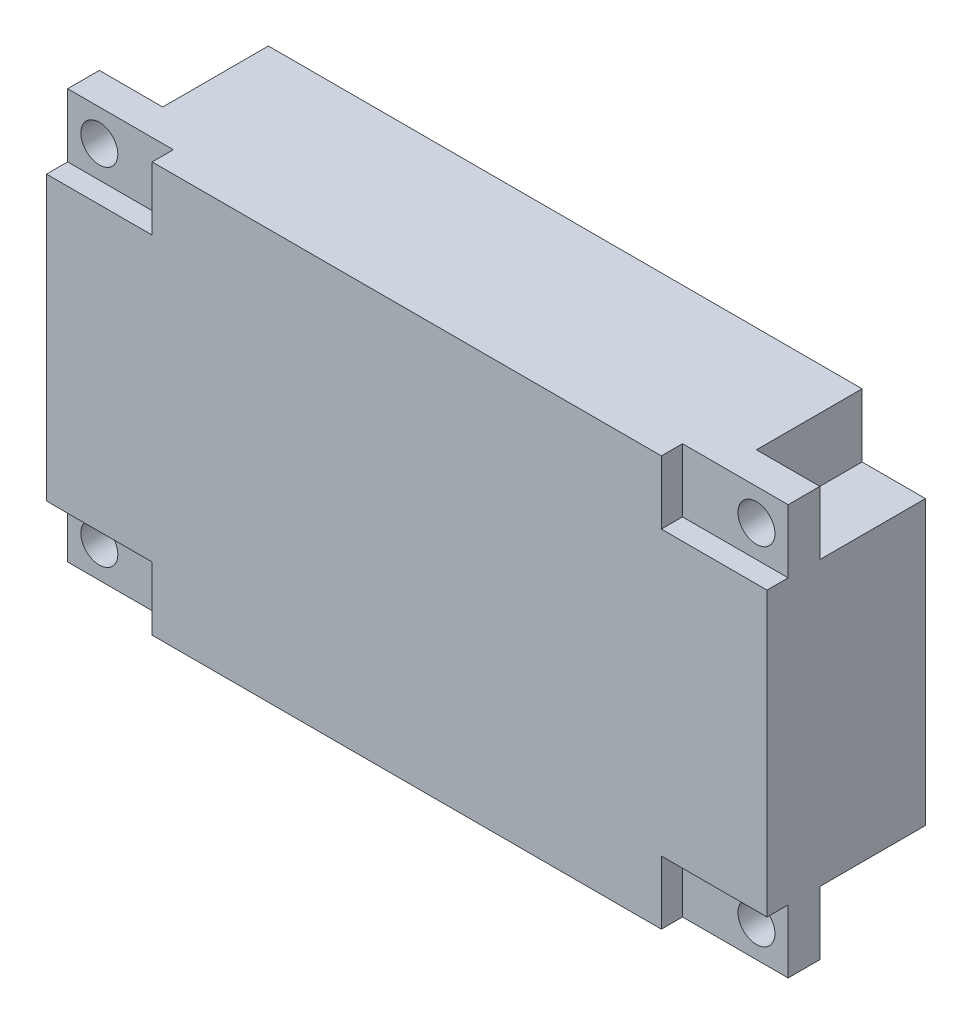
ISO-10303-21;
HEADER;
FILE_DESCRIPTION(('STEP AP214'),'2;1');
FILE_NAME('part.step','',(''),(''),'','','');
FILE_SCHEMA(('AUTOMOTIVE_DESIGN { 1 0 10303 214 1 1 1 1 }'));
ENDSEC;
DATA;
#1=APPLICATION_CONTEXT('core data for automotive mechanical design processes');
#2=APPLICATION_PROTOCOL_DEFINITION('international standard','automotive_design',2000,#1);
#3=PRODUCT_CONTEXT('',#1,'mechanical');
#4=PRODUCT('Part','Part','',(#3));
#5=PRODUCT_RELATED_PRODUCT_CATEGORY('part','',(#4));
#6=PRODUCT_DEFINITION_FORMATION('','',#4);
#7=PRODUCT_DEFINITION_CONTEXT('part definition',#1,'design');
#8=PRODUCT_DEFINITION('design','',#6,#7);
#9=PRODUCT_DEFINITION_SHAPE('','',#8);
#10=(LENGTH_UNIT() NAMED_UNIT(*) SI_UNIT(.MILLI.,.METRE.));
#11=(NAMED_UNIT(*) PLANE_ANGLE_UNIT() SI_UNIT($,.RADIAN.));
#12=(NAMED_UNIT(*) SI_UNIT($,.STERADIAN.) SOLID_ANGLE_UNIT());
#13=UNCERTAINTY_MEASURE_WITH_UNIT(LENGTH_MEASURE(1.E-05),#10,'distance_accuracy_value','');
#14=(GEOMETRIC_REPRESENTATION_CONTEXT(3) GLOBAL_UNCERTAINTY_ASSIGNED_CONTEXT((#13)) GLOBAL_UNIT_ASSIGNED_CONTEXT((#10,
#11,#12)) REPRESENTATION_CONTEXT('',''));
#15=CARTESIAN_POINT('',(0.,0.,0.));
#16=DIRECTION('',(0.,0.,1.));
#17=DIRECTION('',(1.,0.,0.));
#18=AXIS2_PLACEMENT_3D('',#15,#16,#17);
#19=CARTESIAN_POINT('',(65.2,3.,0.));
#20=DIRECTION('',(0.,0.,1.));
#21=DIRECTION('',(1.,0.,0.));
#22=AXIS2_PLACEMENT_3D('',#19,#20,#21);
#23=CYLINDRICAL_SURFACE('',#22,1.75);
#24=CARTESIAN_POINT('',(65.2,3.,13.));
#25=DIRECTION('',(0.,0.,1.));
#26=DIRECTION('',(1.,0.,0.));
#27=AXIS2_PLACEMENT_3D('',#24,#25,#26);
#28=CIRCLE('',#27,1.75);
#29=CARTESIAN_POINT('',(66.95,3.,13.));
#30=VERTEX_POINT('',#29);
#31=EDGE_CURVE('E300',#30,#30,#28,.T.);
#32=ORIENTED_EDGE('',*,*,#31,.T.);
#33=EDGE_LOOP('',(#32));
#34=FACE_BOUND('',#33,.T.);
#35=CARTESIAN_POINT('',(65.2,3.,10.));
#36=DIRECTION('',(0.,0.,-1.));
#37=DIRECTION('',(-1.,0.,0.));
#38=AXIS2_PLACEMENT_3D('',#35,#36,#37);
#39=CIRCLE('',#38,1.75);
#40=CARTESIAN_POINT('',(63.45,3.,10.));
#41=VERTEX_POINT('',#40);
#42=EDGE_CURVE('E321',#41,#41,#39,.F.);
#43=ORIENTED_EDGE('',*,*,#42,.F.);
#44=EDGE_LOOP('',(#43));
#45=FACE_BOUND('',#44,.T.);
#46=ADVANCED_FACE('F43',(#34,#45),#23,.F.);
#47=CARTESIAN_POINT('',(3.,3.,0.));
#48=DIRECTION('',(0.,0.,1.));
#49=DIRECTION('',(1.,0.,0.));
#50=AXIS2_PLACEMENT_3D('',#47,#48,#49);
#51=CYLINDRICAL_SURFACE('',#50,1.75);
#52=CARTESIAN_POINT('',(3.,3.,13.));
#53=DIRECTION('',(0.,0.,1.));
#54=DIRECTION('',(1.,0.,0.));
#55=AXIS2_PLACEMENT_3D('',#52,#53,#54);
#56=CIRCLE('',#55,1.75);
#57=CARTESIAN_POINT('',(4.75,3.,13.));
#58=VERTEX_POINT('',#57);
#59=EDGE_CURVE('E304',#58,#58,#56,.T.);
#60=ORIENTED_EDGE('',*,*,#59,.T.);
#61=EDGE_LOOP('',(#60));
#62=FACE_BOUND('',#61,.T.);
#63=CARTESIAN_POINT('',(3.,3.,10.));
#64=DIRECTION('',(0.,0.,-1.));
#65=DIRECTION('',(-1.,0.,0.));
#66=AXIS2_PLACEMENT_3D('',#63,#64,#65);
#67=CIRCLE('',#66,1.75);
#68=CARTESIAN_POINT('',(1.25,3.,10.));
#69=VERTEX_POINT('',#68);
#70=EDGE_CURVE('E317',#69,#69,#67,.F.);
#71=ORIENTED_EDGE('',*,*,#70,.F.);
#72=EDGE_LOOP('',(#71));
#73=FACE_BOUND('',#72,.T.);
#74=ADVANCED_FACE('F351',(#62,#73),#51,.F.);
#75=CARTESIAN_POINT('',(0.,0.,15.));
#76=DIRECTION('',(1.,0.,0.));
#77=DIRECTION('',(0.,0.,-1.));
#78=AXIS2_PLACEMENT_3D('',#75,#76,#77);
#79=PLANE('',#78);
#80=DIRECTION('',(0.,-1.,0.));
#81=VECTOR('',#80,1.);
#82=CARTESIAN_POINT('',(0.,0.,0.));
#83=LINE('',#82,#81);
#84=CARTESIAN_POINT('',(0.,32.8,0.));
#85=VERTEX_POINT('',#84);
#86=CARTESIAN_POINT('',(0.,6.,0.));
#87=VERTEX_POINT('',#86);
#88=EDGE_CURVE('E251',#85,#87,#83,.T.);
#89=ORIENTED_EDGE('',*,*,#88,.T.);
#90=DIRECTION('',(0.,0.,-1.));
#91=VECTOR('',#90,1.);
#92=CARTESIAN_POINT('',(0.,6.,10.));
#93=LINE('',#92,#91);
#94=CARTESIAN_POINT('',(0.,6.,10.));
#95=VERTEX_POINT('',#94);
#96=EDGE_CURVE('E690',#95,#87,#93,.T.);
#97=ORIENTED_EDGE('',*,*,#96,.F.);
#98=DIRECTION('',(0.,1.,0.));
#99=VECTOR('',#98,1.);
#100=CARTESIAN_POINT('',(0.,0.,10.));
#101=LINE('',#100,#99);
#102=CARTESIAN_POINT('',(0.,0.,10.));
#103=VERTEX_POINT('',#102);
#104=EDGE_CURVE('E708',#103,#95,#101,.T.);
#105=ORIENTED_EDGE('',*,*,#104,.F.);
#106=DIRECTION('',(0.,0.,-1.));
#107=VECTOR('',#106,1.);
#108=CARTESIAN_POINT('',(0.,0.,15.));
#109=LINE('',#108,#107);
#110=CARTESIAN_POINT('',(0.,0.,13.));
#111=VERTEX_POINT('',#110);
#112=EDGE_CURVE('E11',#111,#103,#109,.T.);
#113=ORIENTED_EDGE('',*,*,#112,.F.);
#114=DIRECTION('',(0.,-1.,0.));
#115=VECTOR('',#114,1.);
#116=CARTESIAN_POINT('',(0.,6.,13.));
#117=LINE('',#116,#115);
#118=CARTESIAN_POINT('',(0.,6.,13.));
#119=VERTEX_POINT('',#118);
#120=EDGE_CURVE('E513',#119,#111,#117,.T.);
#121=ORIENTED_EDGE('',*,*,#120,.F.);
#122=DIRECTION('',(0.,0.,1.));
#123=VECTOR('',#122,1.);
#124=CARTESIAN_POINT('',(0.,6.,13.));
#125=LINE('',#124,#123);
#126=CARTESIAN_POINT('',(0.,6.,15.));
#127=VERTEX_POINT('',#126);
#128=EDGE_CURVE('E504',#119,#127,#125,.T.);
#129=ORIENTED_EDGE('',*,*,#128,.T.);
#130=DIRECTION('',(0.,-1.,0.));
#131=VECTOR('',#130,1.);
#132=CARTESIAN_POINT('',(0.,0.,15.));
#133=LINE('',#132,#131);
#134=CARTESIAN_POINT('',(0.,32.8,15.));
#135=VERTEX_POINT('',#134);
#136=EDGE_CURVE('E285',#135,#127,#133,.T.);
#137=ORIENTED_EDGE('',*,*,#136,.F.);
#138=DIRECTION('',(0.,0.,1.));
#139=VECTOR('',#138,1.);
#140=CARTESIAN_POINT('',(0.,32.8,13.));
#141=LINE('',#140,#139);
#142=CARTESIAN_POINT('',(0.,32.8,13.));
#143=VERTEX_POINT('',#142);
#144=EDGE_CURVE('E609',#143,#135,#141,.T.);
#145=ORIENTED_EDGE('',*,*,#144,.F.);
#146=DIRECTION('',(0.,-1.,0.));
#147=VECTOR('',#146,1.);
#148=CARTESIAN_POINT('',(0.,32.8,13.));
#149=LINE('',#148,#147);
#150=CARTESIAN_POINT('',(0.,38.8,13.));
#151=VERTEX_POINT('',#150);
#152=EDGE_CURVE('E593',#151,#143,#149,.T.);
#153=ORIENTED_EDGE('',*,*,#152,.F.);
#154=DIRECTION('',(0.,0.,-1.));
#155=VECTOR('',#154,1.);
#156=CARTESIAN_POINT('',(0.,38.8,15.));
#157=LINE('',#156,#155);
#158=CARTESIAN_POINT('',(0.,38.8,10.));
#159=VERTEX_POINT('',#158);
#160=EDGE_CURVE('E286',#151,#159,#157,.T.);
#161=ORIENTED_EDGE('',*,*,#160,.T.);
#162=DIRECTION('',(0.,1.,0.));
#163=VECTOR('',#162,1.);
#164=CARTESIAN_POINT('',(0.,38.8,10.));
#165=LINE('',#164,#163);
#166=CARTESIAN_POINT('',(0.,32.8,10.));
#167=VERTEX_POINT('',#166);
#168=EDGE_CURVE('E253',#167,#159,#165,.T.);
#169=ORIENTED_EDGE('',*,*,#168,.F.);
#170=DIRECTION('',(0.,0.,-1.));
#171=VECTOR('',#170,1.);
#172=CARTESIAN_POINT('',(0.,32.8,10.));
#173=LINE('',#172,#171);
#174=EDGE_CURVE('E236',#167,#85,#173,.T.);
#175=ORIENTED_EDGE('',*,*,#174,.T.);
#176=EDGE_LOOP('',(#89,#97,#105,#113,#121,#129,#137,#145,#153,#161,#169,#175));
#177=FACE_BOUND('',#176,.T.);
#178=ADVANCED_FACE('F45',(#177),#79,.F.);
#179=CARTESIAN_POINT('',(0.,0.,15.));
#180=DIRECTION('',(0.,1.,0.));
#181=DIRECTION('',(0.,0.,1.));
#182=AXIS2_PLACEMENT_3D('',#179,#180,#181);
#183=PLANE('',#182);
#184=DIRECTION('',(1.,0.,0.));
#185=VECTOR('',#184,1.);
#186=CARTESIAN_POINT('',(0.,0.,0.));
#187=LINE('',#186,#185);
#188=CARTESIAN_POINT('',(6.,0.,0.));
#189=VERTEX_POINT('',#188);
#190=CARTESIAN_POINT('',(62.2,0.,0.));
#191=VERTEX_POINT('',#190);
#192=EDGE_CURVE('E263',#189,#191,#187,.T.);
#193=ORIENTED_EDGE('',*,*,#192,.T.);
#194=DIRECTION('',(0.,0.,-1.));
#195=VECTOR('',#194,1.);
#196=CARTESIAN_POINT('',(62.2,0.,10.));
#197=LINE('',#196,#195);
#198=CARTESIAN_POINT('',(62.2,0.,10.));
#199=VERTEX_POINT('',#198);
#200=EDGE_CURVE('E61',#199,#191,#197,.T.);
#201=ORIENTED_EDGE('',*,*,#200,.F.);
#202=DIRECTION('',(-1.,0.,0.));
#203=VECTOR('',#202,1.);
#204=CARTESIAN_POINT('',(68.2,0.,10.));
#205=LINE('',#204,#203);
#206=CARTESIAN_POINT('',(68.2,0.,10.));
#207=VERTEX_POINT('',#206);
#208=EDGE_CURVE('E463',#207,#199,#205,.T.);
#209=ORIENTED_EDGE('',*,*,#208,.F.);
#210=DIRECTION('',(0.,0.,-1.));
#211=VECTOR('',#210,1.);
#212=CARTESIAN_POINT('',(68.2,0.,15.));
#213=LINE('',#212,#211);
#214=CARTESIAN_POINT('',(68.2,0.,13.));
#215=VERTEX_POINT('',#214);
#216=EDGE_CURVE('E53',#215,#207,#213,.T.);
#217=ORIENTED_EDGE('',*,*,#216,.F.);
#218=DIRECTION('',(1.,0.,0.));
#219=VECTOR('',#218,1.);
#220=CARTESIAN_POINT('',(58.2,0.,13.));
#221=LINE('',#220,#219);
#222=CARTESIAN_POINT('',(58.2,0.,13.));
#223=VERTEX_POINT('',#222);
#224=EDGE_CURVE('E546',#223,#215,#221,.T.);
#225=ORIENTED_EDGE('',*,*,#224,.F.);
#226=DIRECTION('',(0.,0.,1.));
#227=VECTOR('',#226,1.);
#228=CARTESIAN_POINT('',(58.2,0.,13.));
#229=LINE('',#228,#227);
#230=CARTESIAN_POINT('',(58.2,0.,15.));
#231=VERTEX_POINT('',#230);
#232=EDGE_CURVE('E538',#223,#231,#229,.T.);
#233=ORIENTED_EDGE('',*,*,#232,.T.);
#234=DIRECTION('',(1.,0.,0.));
#235=VECTOR('',#234,1.);
#236=CARTESIAN_POINT('',(0.,0.,15.));
#237=LINE('',#236,#235);
#238=CARTESIAN_POINT('',(10.,0.,15.));
#239=VERTEX_POINT('',#238);
#240=EDGE_CURVE('E622',#239,#231,#237,.T.);
#241=ORIENTED_EDGE('',*,*,#240,.F.);
#242=DIRECTION('',(0.,0.,1.));
#243=VECTOR('',#242,1.);
#244=CARTESIAN_POINT('',(10.,0.,13.));
#245=LINE('',#244,#243);
#246=CARTESIAN_POINT('',(10.,0.,13.));
#247=VERTEX_POINT('',#246);
#248=EDGE_CURVE('E497',#247,#239,#245,.T.);
#249=ORIENTED_EDGE('',*,*,#248,.F.);
#250=DIRECTION('',(1.,0.,0.));
#251=VECTOR('',#250,1.);
#252=CARTESIAN_POINT('',(0.,0.,13.));
#253=LINE('',#252,#251);
#254=EDGE_CURVE('E525',#111,#247,#253,.T.);
#255=ORIENTED_EDGE('',*,*,#254,.F.);
#256=ORIENTED_EDGE('',*,*,#112,.T.);
#257=DIRECTION('',(-1.,0.,0.));
#258=VECTOR('',#257,1.);
#259=CARTESIAN_POINT('',(6.,0.,10.));
#260=LINE('',#259,#258);
#261=CARTESIAN_POINT('',(6.,0.,10.));
#262=VERTEX_POINT('',#261);
#263=EDGE_CURVE('E698',#262,#103,#260,.T.);
#264=ORIENTED_EDGE('',*,*,#263,.F.);
#265=DIRECTION('',(0.,0.,-1.));
#266=VECTOR('',#265,1.);
#267=CARTESIAN_POINT('',(6.,0.,10.));
#268=LINE('',#267,#266);
#269=EDGE_CURVE('E440',#262,#189,#268,.T.);
#270=ORIENTED_EDGE('',*,*,#269,.T.);
#271=EDGE_LOOP('',(#193,#201,#209,#217,#225,#233,#241,#249,#255,#256,#264,#270));
#272=FACE_BOUND('',#271,.T.);
#273=ADVANCED_FACE('F429',(#272),#183,.F.);
#274=CARTESIAN_POINT('',(68.2,0.,15.));
#275=DIRECTION('',(-1.,0.,0.));
#276=DIRECTION('',(0.,0.,1.));
#277=AXIS2_PLACEMENT_3D('',#274,#275,#276);
#278=PLANE('',#277);
#279=DIRECTION('',(0.,-1.,0.));
#280=VECTOR('',#279,1.);
#281=CARTESIAN_POINT('',(68.2,6.,10.));
#282=LINE('',#281,#280);
#283=CARTESIAN_POINT('',(68.2,6.,10.));
#284=VERTEX_POINT('',#283);
#285=EDGE_CURVE('E451',#284,#207,#282,.T.);
#286=ORIENTED_EDGE('',*,*,#285,.F.);
#287=DIRECTION('',(0.,0.,-1.));
#288=VECTOR('',#287,1.);
#289=CARTESIAN_POINT('',(68.2,6.,10.));
#290=LINE('',#289,#288);
#291=CARTESIAN_POINT('',(68.2,6.,0.));
#292=VERTEX_POINT('',#291);
#293=EDGE_CURVE('E718',#284,#292,#290,.T.);
#294=ORIENTED_EDGE('',*,*,#293,.T.);
#295=DIRECTION('',(0.,1.,0.));
#296=VECTOR('',#295,1.);
#297=CARTESIAN_POINT('',(68.2,0.,0.));
#298=LINE('',#297,#296);
#299=CARTESIAN_POINT('',(68.2,32.8,0.));
#300=VERTEX_POINT('',#299);
#301=EDGE_CURVE('E269',#292,#300,#298,.T.);
#302=ORIENTED_EDGE('',*,*,#301,.T.);
#303=DIRECTION('',(0.,0.,-1.));
#304=VECTOR('',#303,1.);
#305=CARTESIAN_POINT('',(68.2,32.8,10.));
#306=LINE('',#305,#304);
#307=CARTESIAN_POINT('',(68.2,32.8,10.));
#308=VERTEX_POINT('',#307);
#309=EDGE_CURVE('E69',#308,#300,#306,.T.);
#310=ORIENTED_EDGE('',*,*,#309,.F.);
#311=DIRECTION('',(0.,-1.,0.));
#312=VECTOR('',#311,1.);
#313=CARTESIAN_POINT('',(68.2,32.8,10.));
#314=LINE('',#313,#312);
#315=CARTESIAN_POINT('',(68.2,38.8,10.));
#316=VERTEX_POINT('',#315);
#317=EDGE_CURVE('E469',#316,#308,#314,.T.);
#318=ORIENTED_EDGE('',*,*,#317,.F.);
#319=DIRECTION('',(0.,0.,-1.));
#320=VECTOR('',#319,1.);
#321=CARTESIAN_POINT('',(68.2,38.8,15.));
#322=LINE('',#321,#320);
#323=CARTESIAN_POINT('',(68.2,38.8,13.));
#324=VERTEX_POINT('',#323);
#325=EDGE_CURVE('E289',#324,#316,#322,.T.);
#326=ORIENTED_EDGE('',*,*,#325,.F.);
#327=DIRECTION('',(0.,1.,0.));
#328=VECTOR('',#327,1.);
#329=CARTESIAN_POINT('',(68.2,32.8,13.));
#330=LINE('',#329,#328);
#331=CARTESIAN_POINT('',(68.2,32.8,13.));
#332=VERTEX_POINT('',#331);
#333=EDGE_CURVE('E576',#332,#324,#330,.T.);
#334=ORIENTED_EDGE('',*,*,#333,.F.);
#335=DIRECTION('',(0.,0.,1.));
#336=VECTOR('',#335,1.);
#337=CARTESIAN_POINT('',(68.2,32.8,13.));
#338=LINE('',#337,#336);
#339=CARTESIAN_POINT('',(68.2,32.8,15.));
#340=VERTEX_POINT('',#339);
#341=EDGE_CURVE('E312',#332,#340,#338,.T.);
#342=ORIENTED_EDGE('',*,*,#341,.T.);
#343=DIRECTION('',(0.,1.,0.));
#344=VECTOR('',#343,1.);
#345=CARTESIAN_POINT('',(68.2,0.,15.));
#346=LINE('',#345,#344);
#347=CARTESIAN_POINT('',(68.2,6.,15.));
#348=VERTEX_POINT('',#347);
#349=EDGE_CURVE('E625',#348,#340,#346,.T.);
#350=ORIENTED_EDGE('',*,*,#349,.F.);
#351=DIRECTION('',(0.,0.,1.));
#352=VECTOR('',#351,1.);
#353=CARTESIAN_POINT('',(68.2,6.,13.));
#354=LINE('',#353,#352);
#355=CARTESIAN_POINT('',(68.2,6.,13.));
#356=VERTEX_POINT('',#355);
#357=EDGE_CURVE('E531',#356,#348,#354,.T.);
#358=ORIENTED_EDGE('',*,*,#357,.F.);
#359=DIRECTION('',(0.,1.,0.));
#360=VECTOR('',#359,1.);
#361=CARTESIAN_POINT('',(68.2,0.,13.));
#362=LINE('',#361,#360);
#363=EDGE_CURVE('E557',#215,#356,#362,.T.);
#364=ORIENTED_EDGE('',*,*,#363,.F.);
#365=ORIENTED_EDGE('',*,*,#216,.T.);
#366=EDGE_LOOP('',(#286,#294,#302,#310,#318,#326,#334,#342,#350,#358,#364,#365));
#367=FACE_BOUND('',#366,.T.);
#368=ADVANCED_FACE('F426',(#367),#278,.F.);
#369=CARTESIAN_POINT('',(0.,38.8,15.));
#370=DIRECTION('',(0.,-1.,0.));
#371=DIRECTION('',(0.,0.,-1.));
#372=AXIS2_PLACEMENT_3D('',#369,#370,#371);
#373=PLANE('',#372);
#374=DIRECTION('',(-1.,0.,0.));
#375=VECTOR('',#374,1.);
#376=CARTESIAN_POINT('',(0.,38.8,0.));
#377=LINE('',#376,#375);
#378=CARTESIAN_POINT('',(62.2,38.8,0.));
#379=VERTEX_POINT('',#378);
#380=CARTESIAN_POINT('',(6.,38.8,0.));
#381=VERTEX_POINT('',#380);
#382=EDGE_CURVE('E281',#379,#381,#377,.T.);
#383=ORIENTED_EDGE('',*,*,#382,.T.);
#384=DIRECTION('',(0.,0.,-1.));
#385=VECTOR('',#384,1.);
#386=CARTESIAN_POINT('',(6.,38.8,10.));
#387=LINE('',#386,#385);
#388=CARTESIAN_POINT('',(6.,38.8,10.));
#389=VERTEX_POINT('',#388);
#390=EDGE_CURVE('E680',#389,#381,#387,.T.);
#391=ORIENTED_EDGE('',*,*,#390,.F.);
#392=DIRECTION('',(1.,0.,0.));
#393=VECTOR('',#392,1.);
#394=CARTESIAN_POINT('',(6.,38.8,10.));
#395=LINE('',#394,#393);
#396=EDGE_CURVE('E245',#159,#389,#395,.T.);
#397=ORIENTED_EDGE('',*,*,#396,.F.);
#398=ORIENTED_EDGE('',*,*,#160,.F.);
#399=DIRECTION('',(-1.,0.,0.));
#400=VECTOR('',#399,1.);
#401=CARTESIAN_POINT('',(0.,38.8,13.));
#402=LINE('',#401,#400);
#403=CARTESIAN_POINT('',(10.,38.8,13.));
#404=VERTEX_POINT('',#403);
#405=EDGE_CURVE('E606',#404,#151,#402,.T.);
#406=ORIENTED_EDGE('',*,*,#405,.F.);
#407=DIRECTION('',(0.,0.,1.));
#408=VECTOR('',#407,1.);
#409=CARTESIAN_POINT('',(10.,38.8,13.));
#410=LINE('',#409,#408);
#411=CARTESIAN_POINT('',(10.,38.8,15.));
#412=VERTEX_POINT('',#411);
#413=EDGE_CURVE('E264',#404,#412,#410,.T.);
#414=ORIENTED_EDGE('',*,*,#413,.T.);
#415=DIRECTION('',(-1.,0.,0.));
#416=VECTOR('',#415,1.);
#417=CARTESIAN_POINT('',(0.,38.8,15.));
#418=LINE('',#417,#416);
#419=CARTESIAN_POINT('',(58.2,38.8,15.));
#420=VERTEX_POINT('',#419);
#421=EDGE_CURVE('E275',#420,#412,#418,.T.);
#422=ORIENTED_EDGE('',*,*,#421,.F.);
#423=DIRECTION('',(0.,0.,1.));
#424=VECTOR('',#423,1.);
#425=CARTESIAN_POINT('',(58.2,38.8,13.));
#426=LINE('',#425,#424);
#427=CARTESIAN_POINT('',(58.2,38.8,13.));
#428=VERTEX_POINT('',#427);
#429=EDGE_CURVE('E563',#428,#420,#426,.T.);
#430=ORIENTED_EDGE('',*,*,#429,.F.);
#431=DIRECTION('',(-1.,0.,0.));
#432=VECTOR('',#431,1.);
#433=CARTESIAN_POINT('',(68.2,38.8,13.));
#434=LINE('',#433,#432);
#435=EDGE_CURVE('E587',#324,#428,#434,.T.);
#436=ORIENTED_EDGE('',*,*,#435,.F.);
#437=ORIENTED_EDGE('',*,*,#325,.T.);
#438=DIRECTION('',(1.,0.,0.));
#439=VECTOR('',#438,1.);
#440=CARTESIAN_POINT('',(68.2,38.8,10.));
#441=LINE('',#440,#439);
#442=CARTESIAN_POINT('',(62.2,38.8,10.));
#443=VERTEX_POINT('',#442);
#444=EDGE_CURVE('E481',#443,#316,#441,.T.);
#445=ORIENTED_EDGE('',*,*,#444,.F.);
#446=DIRECTION('',(0.,0.,-1.));
#447=VECTOR('',#446,1.);
#448=CARTESIAN_POINT('',(62.2,38.8,10.));
#449=LINE('',#448,#447);
#450=EDGE_CURVE('E318',#443,#379,#449,.T.);
#451=ORIENTED_EDGE('',*,*,#450,.T.);
#452=EDGE_LOOP('',(#383,#391,#397,#398,#406,#414,#422,#430,#436,#437,#445,#451));
#453=FACE_BOUND('',#452,.T.);
#454=ADVANCED_FACE('F420',(#453),#373,.F.);
#455=CARTESIAN_POINT('',(0.,0.,15.));
#456=DIRECTION('',(0.,0.,-1.));
#457=DIRECTION('',(-1.,0.,0.));
#458=AXIS2_PLACEMENT_3D('',#455,#456,#457);
#459=PLANE('',#458);
#460=ORIENTED_EDGE('',*,*,#349,.T.);
#461=DIRECTION('',(1.,0.,0.));
#462=VECTOR('',#461,1.);
#463=CARTESIAN_POINT('',(58.2,32.8,15.));
#464=LINE('',#463,#462);
#465=CARTESIAN_POINT('',(58.2,32.8,15.));
#466=VERTEX_POINT('',#465);
#467=EDGE_CURVE('E573',#466,#340,#464,.T.);
#468=ORIENTED_EDGE('',*,*,#467,.F.);
#469=DIRECTION('',(0.,-1.,0.));
#470=VECTOR('',#469,1.);
#471=CARTESIAN_POINT('',(58.2,38.8,15.));
#472=LINE('',#471,#470);
#473=EDGE_CURVE('E542',#420,#466,#472,.T.);
#474=ORIENTED_EDGE('',*,*,#473,.F.);
#475=ORIENTED_EDGE('',*,*,#421,.T.);
#476=DIRECTION('',(0.,1.,0.));
#477=VECTOR('',#476,1.);
#478=CARTESIAN_POINT('',(10.,38.8,15.));
#479=LINE('',#478,#477);
#480=CARTESIAN_POINT('',(10.,32.8,15.));
#481=VERTEX_POINT('',#480);
#482=EDGE_CURVE('E598',#481,#412,#479,.T.);
#483=ORIENTED_EDGE('',*,*,#482,.F.);
#484=DIRECTION('',(1.,0.,0.));
#485=VECTOR('',#484,1.);
#486=CARTESIAN_POINT('',(10.,32.8,15.));
#487=LINE('',#486,#485);
#488=EDGE_CURVE('E517',#135,#481,#487,.T.);
#489=ORIENTED_EDGE('',*,*,#488,.F.);
#490=ORIENTED_EDGE('',*,*,#136,.T.);
#491=DIRECTION('',(-1.,0.,0.));
#492=VECTOR('',#491,1.);
#493=CARTESIAN_POINT('',(10.,6.,15.));
#494=LINE('',#493,#492);
#495=CARTESIAN_POINT('',(10.,6.,15.));
#496=VERTEX_POINT('',#495);
#497=EDGE_CURVE('E509',#496,#127,#494,.T.);
#498=ORIENTED_EDGE('',*,*,#497,.F.);
#499=DIRECTION('',(0.,1.,0.));
#500=VECTOR('',#499,1.);
#501=CARTESIAN_POINT('',(10.,0.,15.));
#502=LINE('',#501,#500);
#503=EDGE_CURVE('E512',#239,#496,#502,.T.);
#504=ORIENTED_EDGE('',*,*,#503,.F.);
#505=ORIENTED_EDGE('',*,*,#240,.T.);
#506=DIRECTION('',(0.,-1.,0.));
#507=VECTOR('',#506,1.);
#508=CARTESIAN_POINT('',(58.2,6.,15.));
#509=LINE('',#508,#507);
#510=CARTESIAN_POINT('',(58.2,6.,15.));
#511=VERTEX_POINT('',#510);
#512=EDGE_CURVE('E543',#511,#231,#509,.T.);
#513=ORIENTED_EDGE('',*,*,#512,.F.);
#514=DIRECTION('',(-1.,0.,0.));
#515=VECTOR('',#514,1.);
#516=CARTESIAN_POINT('',(68.2,6.,15.));
#517=LINE('',#516,#515);
#518=EDGE_CURVE('E508',#348,#511,#517,.T.);
#519=ORIENTED_EDGE('',*,*,#518,.F.);
#520=EDGE_LOOP('',(#460,#468,#474,#475,#483,#489,#490,#498,#504,#505,#513,#519));
#521=FACE_BOUND('',#520,.T.);
#522=ADVANCED_FACE('F417',(#521),#459,.F.);
#523=CARTESIAN_POINT('',(0.,0.,0.));
#524=DIRECTION('',(0.,0.,-1.));
#525=DIRECTION('',(-1.,0.,0.));
#526=AXIS2_PLACEMENT_3D('',#523,#524,#525);
#527=PLANE('',#526);
#528=DIRECTION('',(1.,0.,0.));
#529=VECTOR('',#528,1.);
#530=CARTESIAN_POINT('',(62.2,6.,0.));
#531=LINE('',#530,#529);
#532=CARTESIAN_POINT('',(62.2,6.,0.));
#533=VERTEX_POINT('',#532);
#534=EDGE_CURVE('E444',#533,#292,#531,.T.);
#535=ORIENTED_EDGE('',*,*,#534,.F.);
#536=DIRECTION('',(0.,1.,0.));
#537=VECTOR('',#536,1.);
#538=CARTESIAN_POINT('',(62.2,0.,0.));
#539=LINE('',#538,#537);
#540=EDGE_CURVE('E442',#191,#533,#539,.T.);
#541=ORIENTED_EDGE('',*,*,#540,.F.);
#542=ORIENTED_EDGE('',*,*,#192,.F.);
#543=DIRECTION('',(0.,-1.,0.));
#544=VECTOR('',#543,1.);
#545=CARTESIAN_POINT('',(6.,6.,0.));
#546=LINE('',#545,#544);
#547=CARTESIAN_POINT('',(6.,6.,0.));
#548=VERTEX_POINT('',#547);
#549=EDGE_CURVE('E441',#548,#189,#546,.T.);
#550=ORIENTED_EDGE('',*,*,#549,.F.);
#551=DIRECTION('',(1.,0.,0.));
#552=VECTOR('',#551,1.);
#553=CARTESIAN_POINT('',(0.,6.,0.));
#554=LINE('',#553,#552);
#555=EDGE_CURVE('E255',#87,#548,#554,.T.);
#556=ORIENTED_EDGE('',*,*,#555,.F.);
#557=ORIENTED_EDGE('',*,*,#88,.F.);
#558=DIRECTION('',(-1.,0.,0.));
#559=VECTOR('',#558,1.);
#560=CARTESIAN_POINT('',(0.,32.8,0.));
#561=LINE('',#560,#559);
#562=CARTESIAN_POINT('',(6.,32.8,0.));
#563=VERTEX_POINT('',#562);
#564=EDGE_CURVE('E232',#563,#85,#561,.T.);
#565=ORIENTED_EDGE('',*,*,#564,.F.);
#566=DIRECTION('',(0.,-1.,0.));
#567=VECTOR('',#566,1.);
#568=CARTESIAN_POINT('',(6.,32.8,0.));
#569=LINE('',#568,#567);
#570=EDGE_CURVE('E244',#381,#563,#569,.T.);
#571=ORIENTED_EDGE('',*,*,#570,.F.);
#572=ORIENTED_EDGE('',*,*,#382,.F.);
#573=DIRECTION('',(0.,1.,0.));
#574=VECTOR('',#573,1.);
#575=CARTESIAN_POINT('',(62.2,38.8,0.));
#576=LINE('',#575,#574);
#577=CARTESIAN_POINT('',(62.2,32.8,0.));
#578=VERTEX_POINT('',#577);
#579=EDGE_CURVE('E473',#578,#379,#576,.T.);
#580=ORIENTED_EDGE('',*,*,#579,.F.);
#581=DIRECTION('',(-1.,0.,0.));
#582=VECTOR('',#581,1.);
#583=CARTESIAN_POINT('',(62.2,32.8,0.));
#584=LINE('',#583,#582);
#585=EDGE_CURVE('E484',#300,#578,#584,.T.);
#586=ORIENTED_EDGE('',*,*,#585,.F.);
#587=ORIENTED_EDGE('',*,*,#301,.F.);
#588=EDGE_LOOP('',(#535,#541,#542,#550,#556,#557,#565,#571,#572,#580,#586,#587));
#589=FACE_BOUND('',#588,.T.);
#590=ADVANCED_FACE('F259',(#589),#527,.T.);
#591=CARTESIAN_POINT('',(10.,38.8,13.));
#592=DIRECTION('',(1.,0.,0.));
#593=DIRECTION('',(0.,1.,0.));
#594=AXIS2_PLACEMENT_3D('',#591,#592,#593);
#595=PLANE('',#594);
#596=ORIENTED_EDGE('',*,*,#482,.T.);
#597=ORIENTED_EDGE('',*,*,#413,.F.);
#598=DIRECTION('',(0.,1.,0.));
#599=VECTOR('',#598,1.);
#600=CARTESIAN_POINT('',(10.,38.8,13.));
#601=LINE('',#600,#599);
#602=CARTESIAN_POINT('',(10.,32.8,13.));
#603=VERTEX_POINT('',#602);
#604=EDGE_CURVE('E602',#603,#404,#601,.T.);
#605=ORIENTED_EDGE('',*,*,#604,.F.);
#606=DIRECTION('',(0.,0.,1.));
#607=VECTOR('',#606,1.);
#608=CARTESIAN_POINT('',(10.,32.8,13.));
#609=LINE('',#608,#607);
#610=EDGE_CURVE('E272',#603,#481,#609,.T.);
#611=ORIENTED_EDGE('',*,*,#610,.T.);
#612=EDGE_LOOP('',(#596,#597,#605,#611));
#613=FACE_BOUND('',#612,.T.);
#614=ADVANCED_FACE('F410',(#613),#595,.F.);
#615=CARTESIAN_POINT('',(10.,32.8,13.));
#616=DIRECTION('',(0.,-1.,0.));
#617=DIRECTION('',(0.,0.,-1.));
#618=AXIS2_PLACEMENT_3D('',#615,#616,#617);
#619=PLANE('',#618);
#620=ORIENTED_EDGE('',*,*,#488,.T.);
#621=ORIENTED_EDGE('',*,*,#610,.F.);
#622=DIRECTION('',(1.,0.,0.));
#623=VECTOR('',#622,1.);
#624=CARTESIAN_POINT('',(10.,32.8,13.));
#625=LINE('',#624,#623);
#626=EDGE_CURVE('E597',#143,#603,#625,.T.);
#627=ORIENTED_EDGE('',*,*,#626,.F.);
#628=ORIENTED_EDGE('',*,*,#144,.T.);
#629=EDGE_LOOP('',(#620,#621,#627,#628));
#630=FACE_BOUND('',#629,.T.);
#631=ADVANCED_FACE('F408',(#630),#619,.F.);
#632=CARTESIAN_POINT('',(0.,0.,13.));
#633=DIRECTION('',(0.,0.,-1.));
#634=DIRECTION('',(-1.,0.,0.));
#635=AXIS2_PLACEMENT_3D('',#632,#633,#634);
#636=PLANE('',#635);
#637=CARTESIAN_POINT('',(3.,35.8,13.));
#638=DIRECTION('',(0.,0.,-1.));
#639=DIRECTION('',(-1.,0.,0.));
#640=AXIS2_PLACEMENT_3D('',#637,#638,#639);
#641=CIRCLE('',#640,1.75);
#642=CARTESIAN_POINT('',(1.25,35.8,13.));
#643=VERTEX_POINT('',#642);
#644=EDGE_CURVE('E308',#643,#643,#641,.T.);
#645=ORIENTED_EDGE('',*,*,#644,.T.);
#646=EDGE_LOOP('',(#645));
#647=FACE_BOUND('',#646,.T.);
#648=ORIENTED_EDGE('',*,*,#152,.T.);
#649=ORIENTED_EDGE('',*,*,#626,.T.);
#650=ORIENTED_EDGE('',*,*,#604,.T.);
#651=ORIENTED_EDGE('',*,*,#405,.T.);
#652=EDGE_LOOP('',(#648,#649,#650,#651));
#653=FACE_BOUND('',#652,.T.);
#654=ADVANCED_FACE('F378',(#647,#653),#636,.F.);
#655=CARTESIAN_POINT('',(10.,6.,13.));
#656=DIRECTION('',(0.,1.,0.));
#657=DIRECTION('',(-1.,0.,0.));
#658=AXIS2_PLACEMENT_3D('',#655,#656,#657);
#659=PLANE('',#658);
#660=ORIENTED_EDGE('',*,*,#497,.T.);
#661=ORIENTED_EDGE('',*,*,#128,.F.);
#662=DIRECTION('',(-1.,0.,0.));
#663=VECTOR('',#662,1.);
#664=CARTESIAN_POINT('',(10.,6.,13.));
#665=LINE('',#664,#663);
#666=CARTESIAN_POINT('',(10.,6.,13.));
#667=VERTEX_POINT('',#666);
#668=EDGE_CURVE('E500',#667,#119,#665,.T.);
#669=ORIENTED_EDGE('',*,*,#668,.F.);
#670=DIRECTION('',(0.,0.,1.));
#671=VECTOR('',#670,1.);
#672=CARTESIAN_POINT('',(10.,6.,13.));
#673=LINE('',#672,#671);
#674=EDGE_CURVE('E501',#667,#496,#673,.T.);
#675=ORIENTED_EDGE('',*,*,#674,.T.);
#676=EDGE_LOOP('',(#660,#661,#669,#675));
#677=FACE_BOUND('',#676,.T.);
#678=ADVANCED_FACE('F374',(#677),#659,.F.);
#679=CARTESIAN_POINT('',(10.,0.,13.));
#680=DIRECTION('',(1.,0.,0.));
#681=DIRECTION('',(0.,0.,-1.));
#682=AXIS2_PLACEMENT_3D('',#679,#680,#681);
#683=PLANE('',#682);
#684=ORIENTED_EDGE('',*,*,#503,.T.);
#685=ORIENTED_EDGE('',*,*,#674,.F.);
#686=DIRECTION('',(0.,1.,0.));
#687=VECTOR('',#686,1.);
#688=CARTESIAN_POINT('',(10.,0.,13.));
#689=LINE('',#688,#687);
#690=EDGE_CURVE('E521',#247,#667,#689,.T.);
#691=ORIENTED_EDGE('',*,*,#690,.F.);
#692=ORIENTED_EDGE('',*,*,#248,.T.);
#693=EDGE_LOOP('',(#684,#685,#691,#692));
#694=FACE_BOUND('',#693,.T.);
#695=ADVANCED_FACE('F370',(#694),#683,.F.);
#696=CARTESIAN_POINT('',(0.,0.,13.));
#697=DIRECTION('',(0.,0.,1.));
#698=DIRECTION('',(1.,0.,0.));
#699=AXIS2_PLACEMENT_3D('',#696,#697,#698);
#700=PLANE('',#699);
#701=ORIENTED_EDGE('',*,*,#59,.F.);
#702=EDGE_LOOP('',(#701));
#703=FACE_BOUND('',#702,.T.);
#704=ORIENTED_EDGE('',*,*,#120,.T.);
#705=ORIENTED_EDGE('',*,*,#254,.T.);
#706=ORIENTED_EDGE('',*,*,#690,.T.);
#707=ORIENTED_EDGE('',*,*,#668,.T.);
#708=EDGE_LOOP('',(#704,#705,#706,#707));
#709=FACE_BOUND('',#708,.T.);
#710=ADVANCED_FACE('F373',(#703,#709),#700,.T.);
#711=CARTESIAN_POINT('',(58.2,6.,13.));
#712=DIRECTION('',(-1.,0.,0.));
#713=DIRECTION('',(0.,0.,1.));
#714=AXIS2_PLACEMENT_3D('',#711,#712,#713);
#715=PLANE('',#714);
#716=ORIENTED_EDGE('',*,*,#512,.T.);
#717=ORIENTED_EDGE('',*,*,#232,.F.);
#718=DIRECTION('',(0.,-1.,0.));
#719=VECTOR('',#718,1.);
#720=CARTESIAN_POINT('',(58.2,6.,13.));
#721=LINE('',#720,#719);
#722=CARTESIAN_POINT('',(58.2,6.,13.));
#723=VERTEX_POINT('',#722);
#724=EDGE_CURVE('E534',#723,#223,#721,.T.);
#725=ORIENTED_EDGE('',*,*,#724,.F.);
#726=DIRECTION('',(0.,0.,1.));
#727=VECTOR('',#726,1.);
#728=CARTESIAN_POINT('',(58.2,6.,13.));
#729=LINE('',#728,#727);
#730=EDGE_CURVE('E535',#723,#511,#729,.T.);
#731=ORIENTED_EDGE('',*,*,#730,.T.);
#732=EDGE_LOOP('',(#716,#717,#725,#731));
#733=FACE_BOUND('',#732,.T.);
#734=ADVANCED_FACE('F382',(#733),#715,.F.);
#735=CARTESIAN_POINT('',(68.2,6.,13.));
#736=DIRECTION('',(0.,1.,0.));
#737=DIRECTION('',(-1.,0.,0.));
#738=AXIS2_PLACEMENT_3D('',#735,#736,#737);
#739=PLANE('',#738);
#740=ORIENTED_EDGE('',*,*,#518,.T.);
#741=ORIENTED_EDGE('',*,*,#730,.F.);
#742=DIRECTION('',(-1.,0.,0.));
#743=VECTOR('',#742,1.);
#744=CARTESIAN_POINT('',(68.2,6.,13.));
#745=LINE('',#744,#743);
#746=EDGE_CURVE('E553',#356,#723,#745,.T.);
#747=ORIENTED_EDGE('',*,*,#746,.F.);
#748=ORIENTED_EDGE('',*,*,#357,.T.);
#749=EDGE_LOOP('',(#740,#741,#747,#748));
#750=FACE_BOUND('',#749,.T.);
#751=ADVANCED_FACE('F384',(#750),#739,.F.);
#752=CARTESIAN_POINT('',(0.,0.,13.));
#753=DIRECTION('',(0.,0.,1.));
#754=DIRECTION('',(1.,0.,0.));
#755=AXIS2_PLACEMENT_3D('',#752,#753,#754);
#756=PLANE('',#755);
#757=ORIENTED_EDGE('',*,*,#31,.F.);
#758=EDGE_LOOP('',(#757));
#759=FACE_BOUND('',#758,.T.);
#760=ORIENTED_EDGE('',*,*,#224,.T.);
#761=ORIENTED_EDGE('',*,*,#363,.T.);
#762=ORIENTED_EDGE('',*,*,#746,.T.);
#763=ORIENTED_EDGE('',*,*,#724,.T.);
#764=EDGE_LOOP('',(#760,#761,#762,#763));
#765=FACE_BOUND('',#764,.T.);
#766=ADVANCED_FACE('F387',(#759,#765),#756,.T.);
#767=CARTESIAN_POINT('',(58.2,32.8,13.));
#768=DIRECTION('',(0.,-1.,0.));
#769=DIRECTION('',(0.,0.,-1.));
#770=AXIS2_PLACEMENT_3D('',#767,#768,#769);
#771=PLANE('',#770);
#772=ORIENTED_EDGE('',*,*,#467,.T.);
#773=ORIENTED_EDGE('',*,*,#341,.F.);
#774=DIRECTION('',(1.,0.,0.));
#775=VECTOR('',#774,1.);
#776=CARTESIAN_POINT('',(58.2,32.8,13.));
#777=LINE('',#776,#775);
#778=CARTESIAN_POINT('',(58.2,32.8,13.));
#779=VERTEX_POINT('',#778);
#780=EDGE_CURVE('E566',#779,#332,#777,.T.);
#781=ORIENTED_EDGE('',*,*,#780,.F.);
#782=DIRECTION('',(0.,0.,1.));
#783=VECTOR('',#782,1.);
#784=CARTESIAN_POINT('',(58.2,32.8,13.));
#785=LINE('',#784,#783);
#786=EDGE_CURVE('E567',#779,#466,#785,.T.);
#787=ORIENTED_EDGE('',*,*,#786,.T.);
#788=EDGE_LOOP('',(#772,#773,#781,#787));
#789=FACE_BOUND('',#788,.T.);
#790=ADVANCED_FACE('F394',(#789),#771,.F.);
#791=CARTESIAN_POINT('',(58.2,38.8,13.));
#792=DIRECTION('',(-1.,0.,0.));
#793=DIRECTION('',(0.,0.,1.));
#794=AXIS2_PLACEMENT_3D('',#791,#792,#793);
#795=PLANE('',#794);
#796=ORIENTED_EDGE('',*,*,#473,.T.);
#797=ORIENTED_EDGE('',*,*,#786,.F.);
#798=DIRECTION('',(0.,-1.,0.));
#799=VECTOR('',#798,1.);
#800=CARTESIAN_POINT('',(58.2,38.8,13.));
#801=LINE('',#800,#799);
#802=EDGE_CURVE('E583',#428,#779,#801,.T.);
#803=ORIENTED_EDGE('',*,*,#802,.F.);
#804=ORIENTED_EDGE('',*,*,#429,.T.);
#805=EDGE_LOOP('',(#796,#797,#803,#804));
#806=FACE_BOUND('',#805,.T.);
#807=ADVANCED_FACE('F396',(#806),#795,.F.);
#808=CARTESIAN_POINT('',(0.,0.,13.));
#809=DIRECTION('',(0.,0.,1.));
#810=DIRECTION('',(1.,0.,0.));
#811=AXIS2_PLACEMENT_3D('',#808,#809,#810);
#812=PLANE('',#811);
#813=CARTESIAN_POINT('',(65.2,35.8,13.));
#814=DIRECTION('',(0.,0.,1.));
#815=DIRECTION('',(1.,0.,0.));
#816=AXIS2_PLACEMENT_3D('',#813,#814,#815);
#817=CIRCLE('',#816,1.75);
#818=CARTESIAN_POINT('',(66.95,35.8,13.));
#819=VERTEX_POINT('',#818);
#820=EDGE_CURVE('E296',#819,#819,#817,.T.);
#821=ORIENTED_EDGE('',*,*,#820,.F.);
#822=EDGE_LOOP('',(#821));
#823=FACE_BOUND('',#822,.T.);
#824=ORIENTED_EDGE('',*,*,#333,.T.);
#825=ORIENTED_EDGE('',*,*,#435,.T.);
#826=ORIENTED_EDGE('',*,*,#802,.T.);
#827=ORIENTED_EDGE('',*,*,#780,.T.);
#828=EDGE_LOOP('',(#824,#825,#826,#827));
#829=FACE_BOUND('',#828,.T.);
#830=ADVANCED_FACE('F365',(#823,#829),#812,.T.);
#831=CARTESIAN_POINT('',(65.2,35.8,0.));
#832=DIRECTION('',(0.,0.,1.));
#833=DIRECTION('',(1.,0.,0.));
#834=AXIS2_PLACEMENT_3D('',#831,#832,#833);
#835=CYLINDRICAL_SURFACE('',#834,1.75);
#836=CARTESIAN_POINT('',(65.2,35.8,10.));
#837=DIRECTION('',(0.,0.,1.));
#838=DIRECTION('',(1.,0.,0.));
#839=AXIS2_PLACEMENT_3D('',#836,#837,#838);
#840=CIRCLE('',#839,1.75);
#841=CARTESIAN_POINT('',(66.95,35.8,10.));
#842=VERTEX_POINT('',#841);
#843=EDGE_CURVE('E47',#842,#842,#840,.F.);
#844=ORIENTED_EDGE('',*,*,#843,.T.);
#845=EDGE_LOOP('',(#844));
#846=FACE_BOUND('',#845,.T.);
#847=ORIENTED_EDGE('',*,*,#820,.T.);
#848=EDGE_LOOP('',(#847));
#849=FACE_BOUND('',#848,.T.);
#850=ADVANCED_FACE('F330',(#846,#849),#835,.F.);
#851=CARTESIAN_POINT('',(3.,35.8,0.));
#852=DIRECTION('',(0.,0.,1.));
#853=DIRECTION('',(1.,0.,0.));
#854=AXIS2_PLACEMENT_3D('',#851,#852,#853);
#855=CYLINDRICAL_SURFACE('',#854,1.75);
#856=CARTESIAN_POINT('',(3.,35.8,10.));
#857=DIRECTION('',(0.,0.,1.));
#858=DIRECTION('',(1.,0.,0.));
#859=AXIS2_PLACEMENT_3D('',#856,#857,#858);
#860=CIRCLE('',#859,1.75);
#861=CARTESIAN_POINT('',(4.75,35.8,10.));
#862=VERTEX_POINT('',#861);
#863=EDGE_CURVE('E313',#862,#862,#860,.F.);
#864=ORIENTED_EDGE('',*,*,#863,.T.);
#865=EDGE_LOOP('',(#864));
#866=FACE_BOUND('',#865,.T.);
#867=ORIENTED_EDGE('',*,*,#644,.F.);
#868=EDGE_LOOP('',(#867));
#869=FACE_BOUND('',#868,.T.);
#870=ADVANCED_FACE('F364',(#866,#869),#855,.F.);
#871=CARTESIAN_POINT('',(0.,0.,10.));
#872=DIRECTION('',(0.,0.,1.));
#873=DIRECTION('',(1.,0.,0.));
#874=AXIS2_PLACEMENT_3D('',#871,#872,#873);
#875=PLANE('',#874);
#876=ORIENTED_EDGE('',*,*,#396,.T.);
#877=DIRECTION('',(0.,-1.,0.));
#878=VECTOR('',#877,1.);
#879=CARTESIAN_POINT('',(6.,32.8,10.));
#880=LINE('',#879,#878);
#881=CARTESIAN_POINT('',(6.,32.8,10.));
#882=VERTEX_POINT('',#881);
#883=EDGE_CURVE('E683',#389,#882,#880,.T.);
#884=ORIENTED_EDGE('',*,*,#883,.T.);
#885=DIRECTION('',(-1.,0.,0.));
#886=VECTOR('',#885,1.);
#887=CARTESIAN_POINT('',(0.,32.8,10.));
#888=LINE('',#887,#886);
#889=EDGE_CURVE('E679',#882,#167,#888,.T.);
#890=ORIENTED_EDGE('',*,*,#889,.T.);
#891=ORIENTED_EDGE('',*,*,#168,.T.);
#892=EDGE_LOOP('',(#876,#884,#890,#891));
#893=FACE_BOUND('',#892,.T.);
#894=ORIENTED_EDGE('',*,*,#863,.F.);
#895=EDGE_LOOP('',(#894));
#896=FACE_BOUND('',#895,.T.);
#897=ADVANCED_FACE('F368',(#893,#896),#875,.F.);
#898=CARTESIAN_POINT('',(0.,32.8,10.));
#899=DIRECTION('',(0.,-1.,0.));
#900=DIRECTION('',(0.,0.,-1.));
#901=AXIS2_PLACEMENT_3D('',#898,#899,#900);
#902=PLANE('',#901);
#903=ORIENTED_EDGE('',*,*,#564,.T.);
#904=ORIENTED_EDGE('',*,*,#174,.F.);
#905=ORIENTED_EDGE('',*,*,#889,.F.);
#906=DIRECTION('',(0.,0.,-1.));
#907=VECTOR('',#906,1.);
#908=CARTESIAN_POINT('',(6.,32.8,10.));
#909=LINE('',#908,#907);
#910=EDGE_CURVE('E238',#882,#563,#909,.T.);
#911=ORIENTED_EDGE('',*,*,#910,.T.);
#912=EDGE_LOOP('',(#903,#904,#905,#911));
#913=FACE_BOUND('',#912,.T.);
#914=ADVANCED_FACE('F234',(#913),#902,.F.);
#915=CARTESIAN_POINT('',(6.,32.8,10.));
#916=DIRECTION('',(1.,0.,0.));
#917=DIRECTION('',(0.,0.,-1.));
#918=AXIS2_PLACEMENT_3D('',#915,#916,#917);
#919=PLANE('',#918);
#920=ORIENTED_EDGE('',*,*,#570,.T.);
#921=ORIENTED_EDGE('',*,*,#910,.F.);
#922=ORIENTED_EDGE('',*,*,#883,.F.);
#923=ORIENTED_EDGE('',*,*,#390,.T.);
#924=EDGE_LOOP('',(#920,#921,#922,#923));
#925=FACE_BOUND('',#924,.T.);
#926=ADVANCED_FACE('F794',(#925),#919,.F.);
#927=CARTESIAN_POINT('',(0.,0.,10.));
#928=DIRECTION('',(0.,0.,-1.));
#929=DIRECTION('',(-1.,0.,0.));
#930=AXIS2_PLACEMENT_3D('',#927,#928,#929);
#931=PLANE('',#930);
#932=ORIENTED_EDGE('',*,*,#263,.T.);
#933=ORIENTED_EDGE('',*,*,#104,.T.);
#934=DIRECTION('',(1.,0.,0.));
#935=VECTOR('',#934,1.);
#936=CARTESIAN_POINT('',(0.,6.,10.));
#937=LINE('',#936,#935);
#938=CARTESIAN_POINT('',(6.,6.,10.));
#939=VERTEX_POINT('',#938);
#940=EDGE_CURVE('E704',#95,#939,#937,.T.);
#941=ORIENTED_EDGE('',*,*,#940,.T.);
#942=DIRECTION('',(0.,-1.,0.));
#943=VECTOR('',#942,1.);
#944=CARTESIAN_POINT('',(6.,6.,10.));
#945=LINE('',#944,#943);
#946=EDGE_CURVE('E693',#939,#262,#945,.T.);
#947=ORIENTED_EDGE('',*,*,#946,.T.);
#948=EDGE_LOOP('',(#932,#933,#941,#947));
#949=FACE_BOUND('',#948,.T.);
#950=ORIENTED_EDGE('',*,*,#70,.T.);
#951=EDGE_LOOP('',(#950));
#952=FACE_BOUND('',#951,.T.);
#953=ADVANCED_FACE('F783',(#949,#952),#931,.T.);
#954=CARTESIAN_POINT('',(6.,6.,10.));
#955=DIRECTION('',(1.,0.,0.));
#956=DIRECTION('',(0.,1.,0.));
#957=AXIS2_PLACEMENT_3D('',#954,#955,#956);
#958=PLANE('',#957);
#959=ORIENTED_EDGE('',*,*,#549,.T.);
#960=ORIENTED_EDGE('',*,*,#269,.F.);
#961=ORIENTED_EDGE('',*,*,#946,.F.);
#962=DIRECTION('',(0.,0.,-1.));
#963=VECTOR('',#962,1.);
#964=CARTESIAN_POINT('',(6.,6.,10.));
#965=LINE('',#964,#963);
#966=EDGE_CURVE('E449',#939,#548,#965,.T.);
#967=ORIENTED_EDGE('',*,*,#966,.T.);
#968=EDGE_LOOP('',(#959,#960,#961,#967));
#969=FACE_BOUND('',#968,.T.);
#970=ADVANCED_FACE('F772',(#969),#958,.F.);
#971=CARTESIAN_POINT('',(0.,6.,10.));
#972=DIRECTION('',(0.,1.,0.));
#973=DIRECTION('',(-1.,0.,0.));
#974=AXIS2_PLACEMENT_3D('',#971,#972,#973);
#975=PLANE('',#974);
#976=ORIENTED_EDGE('',*,*,#555,.T.);
#977=ORIENTED_EDGE('',*,*,#966,.F.);
#978=ORIENTED_EDGE('',*,*,#940,.F.);
#979=ORIENTED_EDGE('',*,*,#96,.T.);
#980=EDGE_LOOP('',(#976,#977,#978,#979));
#981=FACE_BOUND('',#980,.T.);
#982=ADVANCED_FACE('F762',(#981),#975,.F.);
#983=CARTESIAN_POINT('',(0.,0.,10.));
#984=DIRECTION('',(0.,0.,-1.));
#985=DIRECTION('',(-1.,0.,0.));
#986=AXIS2_PLACEMENT_3D('',#983,#984,#985);
#987=PLANE('',#986);
#988=ORIENTED_EDGE('',*,*,#285,.T.);
#989=ORIENTED_EDGE('',*,*,#208,.T.);
#990=DIRECTION('',(0.,1.,0.));
#991=VECTOR('',#990,1.);
#992=CARTESIAN_POINT('',(62.2,0.,10.));
#993=LINE('',#992,#991);
#994=CARTESIAN_POINT('',(62.2,6.,10.));
#995=VERTEX_POINT('',#994);
#996=EDGE_CURVE('E459',#199,#995,#993,.T.);
#997=ORIENTED_EDGE('',*,*,#996,.T.);
#998=DIRECTION('',(1.,0.,0.));
#999=VECTOR('',#998,1.);
#1000=CARTESIAN_POINT('',(62.2,6.,10.));
#1001=LINE('',#1000,#999);
#1002=EDGE_CURVE('E455',#995,#284,#1001,.T.);
#1003=ORIENTED_EDGE('',*,*,#1002,.T.);
#1004=EDGE_LOOP('',(#988,#989,#997,#1003));
#1005=FACE_BOUND('',#1004,.T.);
#1006=ORIENTED_EDGE('',*,*,#42,.T.);
#1007=EDGE_LOOP('',(#1006));
#1008=FACE_BOUND('',#1007,.T.);
#1009=ADVANCED_FACE('F752',(#1005,#1008),#987,.T.);
#1010=CARTESIAN_POINT('',(62.2,6.,10.));
#1011=DIRECTION('',(0.,1.,0.));
#1012=DIRECTION('',(-1.,0.,0.));
#1013=AXIS2_PLACEMENT_3D('',#1010,#1011,#1012);
#1014=PLANE('',#1013);
#1015=ORIENTED_EDGE('',*,*,#534,.T.);
#1016=ORIENTED_EDGE('',*,*,#293,.F.);
#1017=ORIENTED_EDGE('',*,*,#1002,.F.);
#1018=DIRECTION('',(0.,0.,-1.));
#1019=VECTOR('',#1018,1.);
#1020=CARTESIAN_POINT('',(62.2,6.,10.));
#1021=LINE('',#1020,#1019);
#1022=EDGE_CURVE('E716',#995,#533,#1021,.T.);
#1023=ORIENTED_EDGE('',*,*,#1022,.T.);
#1024=EDGE_LOOP('',(#1015,#1016,#1017,#1023));
#1025=FACE_BOUND('',#1024,.T.);
#1026=ADVANCED_FACE('F346',(#1025),#1014,.F.);
#1027=CARTESIAN_POINT('',(62.2,0.,10.));
#1028=DIRECTION('',(-1.,0.,0.));
#1029=DIRECTION('',(0.,0.,1.));
#1030=AXIS2_PLACEMENT_3D('',#1027,#1028,#1029);
#1031=PLANE('',#1030);
#1032=ORIENTED_EDGE('',*,*,#540,.T.);
#1033=ORIENTED_EDGE('',*,*,#1022,.F.);
#1034=ORIENTED_EDGE('',*,*,#996,.F.);
#1035=ORIENTED_EDGE('',*,*,#200,.T.);
#1036=EDGE_LOOP('',(#1032,#1033,#1034,#1035));
#1037=FACE_BOUND('',#1036,.T.);
#1038=ADVANCED_FACE('F336',(#1037),#1031,.F.);
#1039=CARTESIAN_POINT('',(0.,0.,10.));
#1040=DIRECTION('',(0.,0.,1.));
#1041=DIRECTION('',(1.,0.,0.));
#1042=AXIS2_PLACEMENT_3D('',#1039,#1040,#1041);
#1043=PLANE('',#1042);
#1044=ORIENTED_EDGE('',*,*,#317,.T.);
#1045=DIRECTION('',(-1.,0.,0.));
#1046=VECTOR('',#1045,1.);
#1047=CARTESIAN_POINT('',(62.2,32.8,10.));
#1048=LINE('',#1047,#1046);
#1049=CARTESIAN_POINT('',(62.2,32.8,10.));
#1050=VERTEX_POINT('',#1049);
#1051=EDGE_CURVE('E472',#308,#1050,#1048,.T.);
#1052=ORIENTED_EDGE('',*,*,#1051,.T.);
#1053=DIRECTION('',(0.,1.,0.));
#1054=VECTOR('',#1053,1.);
#1055=CARTESIAN_POINT('',(62.2,38.8,10.));
#1056=LINE('',#1055,#1054);
#1057=EDGE_CURVE('E477',#1050,#443,#1056,.T.);
#1058=ORIENTED_EDGE('',*,*,#1057,.T.);
#1059=ORIENTED_EDGE('',*,*,#444,.T.);
#1060=EDGE_LOOP('',(#1044,#1052,#1058,#1059));
#1061=FACE_BOUND('',#1060,.T.);
#1062=ORIENTED_EDGE('',*,*,#843,.F.);
#1063=EDGE_LOOP('',(#1062));
#1064=FACE_BOUND('',#1063,.T.);
#1065=ADVANCED_FACE('F333',(#1061,#1064),#1043,.F.);
#1066=CARTESIAN_POINT('',(62.2,38.8,10.));
#1067=DIRECTION('',(-1.,0.,0.));
#1068=DIRECTION('',(0.,0.,1.));
#1069=AXIS2_PLACEMENT_3D('',#1066,#1067,#1068);
#1070=PLANE('',#1069);
#1071=ORIENTED_EDGE('',*,*,#579,.T.);
#1072=ORIENTED_EDGE('',*,*,#450,.F.);
#1073=ORIENTED_EDGE('',*,*,#1057,.F.);
#1074=DIRECTION('',(0.,0.,-1.));
#1075=VECTOR('',#1074,1.);
#1076=CARTESIAN_POINT('',(62.2,32.8,10.));
#1077=LINE('',#1076,#1075);
#1078=EDGE_CURVE('E492',#1050,#578,#1077,.T.);
#1079=ORIENTED_EDGE('',*,*,#1078,.T.);
#1080=EDGE_LOOP('',(#1071,#1072,#1073,#1079));
#1081=FACE_BOUND('',#1080,.T.);
#1082=ADVANCED_FACE('F335',(#1081),#1070,.F.);
#1083=CARTESIAN_POINT('',(62.2,32.8,10.));
#1084=DIRECTION('',(0.,-1.,0.));
#1085=DIRECTION('',(0.,0.,-1.));
#1086=AXIS2_PLACEMENT_3D('',#1083,#1084,#1085);
#1087=PLANE('',#1086);
#1088=ORIENTED_EDGE('',*,*,#585,.T.);
#1089=ORIENTED_EDGE('',*,*,#1078,.F.);
#1090=ORIENTED_EDGE('',*,*,#1051,.F.);
#1091=ORIENTED_EDGE('',*,*,#309,.T.);
#1092=EDGE_LOOP('',(#1088,#1089,#1090,#1091));
#1093=FACE_BOUND('',#1092,.T.);
#1094=ADVANCED_FACE('F343',(#1093),#1087,.F.);
#1095=CLOSED_SHELL('',(#46,#74,#178,#273,#368,#454,#522,#590,#614,#631,#654,#678,#695,#710,#734,
#751,#766,#790,#807,#830,#850,#870,#897,#914,#926,#953,#970,#982,#1009,#1026,#1038,#1065,#1082,#1094));
#1096=MANIFOLD_SOLID_BREP('B2',#1095);
#1097=ADVANCED_BREP_SHAPE_REPRESENTATION('',(#18,#1096),#14);
#1098=SHAPE_DEFINITION_REPRESENTATION(#9,#1097);
ENDSEC;
END-ISO-10303-21;
